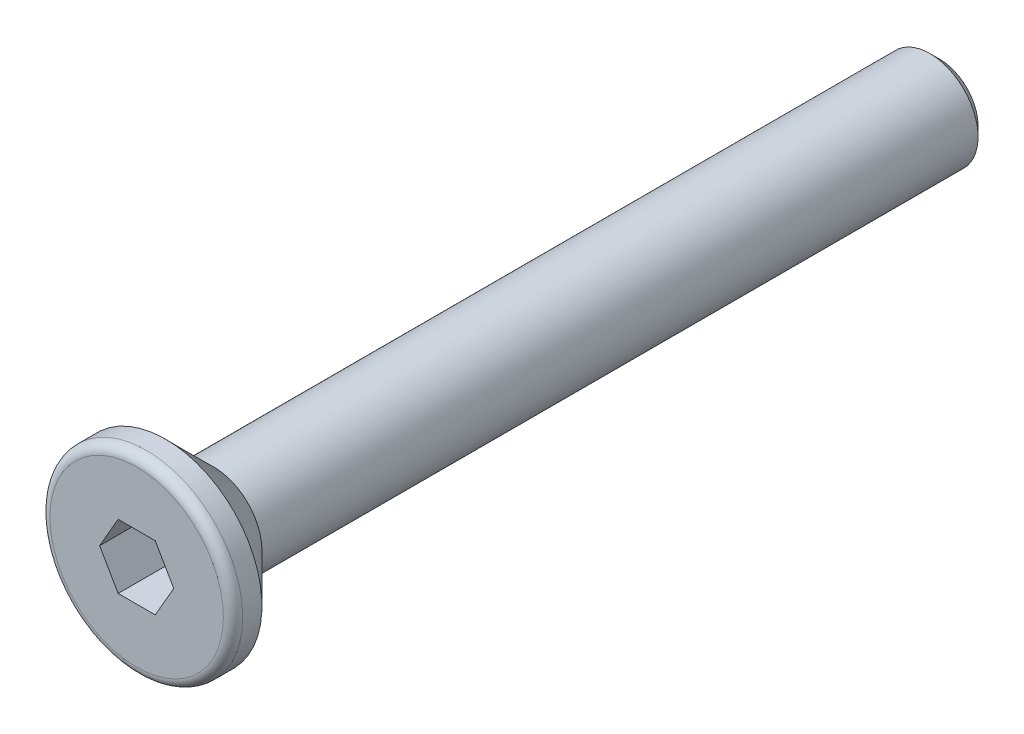
ISO-10303-21;
HEADER;
FILE_DESCRIPTION(('STEP AP214'),'2;1');
FILE_NAME('part.step','',(''),(''),'','','');
FILE_SCHEMA(('AUTOMOTIVE_DESIGN { 1 0 10303 214 1 1 1 1 }'));
ENDSEC;
DATA;
#1=APPLICATION_CONTEXT('core data for automotive mechanical design processes');
#2=APPLICATION_PROTOCOL_DEFINITION('international standard','automotive_design',2000,#1);
#3=PRODUCT_CONTEXT('',#1,'mechanical');
#4=PRODUCT('Part','Part','',(#3));
#5=PRODUCT_RELATED_PRODUCT_CATEGORY('part','',(#4));
#6=PRODUCT_DEFINITION_FORMATION('','',#4);
#7=PRODUCT_DEFINITION_CONTEXT('part definition',#1,'design');
#8=PRODUCT_DEFINITION('design','',#6,#7);
#9=PRODUCT_DEFINITION_SHAPE('','',#8);
#10=(LENGTH_UNIT() NAMED_UNIT(*) SI_UNIT(.MILLI.,.METRE.));
#11=(NAMED_UNIT(*) PLANE_ANGLE_UNIT() SI_UNIT($,.RADIAN.));
#12=(NAMED_UNIT(*) SI_UNIT($,.STERADIAN.) SOLID_ANGLE_UNIT());
#13=UNCERTAINTY_MEASURE_WITH_UNIT(LENGTH_MEASURE(1.E-05),#10,'distance_accuracy_value','');
#14=(GEOMETRIC_REPRESENTATION_CONTEXT(3) GLOBAL_UNCERTAINTY_ASSIGNED_CONTEXT((#13)) GLOBAL_UNIT_ASSIGNED_CONTEXT((#10,
#11,#12)) REPRESENTATION_CONTEXT('',''));
#15=CARTESIAN_POINT('',(0.,0.,0.));
#16=DIRECTION('',(0.,0.,1.));
#17=DIRECTION('',(1.,0.,0.));
#18=AXIS2_PLACEMENT_3D('',#15,#16,#17);
#19=CARTESIAN_POINT('',(0.,0.,12.5));
#20=DIRECTION('',(0.,0.,1.));
#21=DIRECTION('',(1.,0.,0.));
#22=AXIS2_PLACEMENT_3D('',#19,#20,#21);
#23=PLANE('',#22);
#24=CARTESIAN_POINT('',(0.,0.,12.5));
#25=DIRECTION('',(0.,0.,1.));
#26=DIRECTION('',(1.,0.,0.));
#27=AXIS2_PLACEMENT_3D('',#24,#25,#26);
#28=CIRCLE('',#27,2.7);
#29=CARTESIAN_POINT('',(2.7,0.,12.5));
#30=VERTEX_POINT('',#29);
#31=EDGE_CURVE('E11',#30,#30,#28,.T.);
#32=ORIENTED_EDGE('',*,*,#31,.T.);
#33=EDGE_LOOP('',(#32));
#34=FACE_BOUND('',#33,.T.);
#35=DIRECTION('',(0.5,0.866025403784439,0.));
#36=VECTOR('',#35,1.);
#37=CARTESIAN_POINT('',(0.577350269189626,-1.,12.5));
#38=LINE('',#37,#36);
#39=CARTESIAN_POINT('',(0.577350269189626,-1.,12.5));
#40=VERTEX_POINT('',#39);
#41=CARTESIAN_POINT('',(1.15470053837925,0.,12.5));
#42=VERTEX_POINT('',#41);
#43=EDGE_CURVE('E50',#40,#42,#38,.T.);
#44=ORIENTED_EDGE('',*,*,#43,.F.);
#45=DIRECTION('',(1.,0.,0.));
#46=VECTOR('',#45,1.);
#47=CARTESIAN_POINT('',(-0.577350269189626,-1.,12.5));
#48=LINE('',#47,#46);
#49=CARTESIAN_POINT('',(-0.577350269189626,-1.,12.5));
#50=VERTEX_POINT('',#49);
#51=EDGE_CURVE('E133',#50,#40,#48,.T.);
#52=ORIENTED_EDGE('',*,*,#51,.F.);
#53=DIRECTION('',(0.5,-0.866025403784438,0.));
#54=VECTOR('',#53,1.);
#55=CARTESIAN_POINT('',(-1.15470053837925,0.,12.5));
#56=LINE('',#55,#54);
#57=CARTESIAN_POINT('',(-1.15470053837925,0.,12.5));
#58=VERTEX_POINT('',#57);
#59=EDGE_CURVE('E131',#58,#50,#56,.T.);
#60=ORIENTED_EDGE('',*,*,#59,.F.);
#61=DIRECTION('',(-0.5,-0.866025403784439,0.));
#62=VECTOR('',#61,1.);
#63=CARTESIAN_POINT('',(-0.577350269189626,1.,12.5));
#64=LINE('',#63,#62);
#65=CARTESIAN_POINT('',(-0.577350269189626,1.,12.5));
#66=VERTEX_POINT('',#65);
#67=EDGE_CURVE('E98',#66,#58,#64,.T.);
#68=ORIENTED_EDGE('',*,*,#67,.F.);
#69=DIRECTION('',(-1.,0.,0.));
#70=VECTOR('',#69,1.);
#71=CARTESIAN_POINT('',(0.577350269189626,1.,12.5));
#72=LINE('',#71,#70);
#73=CARTESIAN_POINT('',(0.577350269189626,1.,12.5));
#74=VERTEX_POINT('',#73);
#75=EDGE_CURVE('E127',#74,#66,#72,.T.);
#76=ORIENTED_EDGE('',*,*,#75,.F.);
#77=DIRECTION('',(-0.5,0.866025403784438,0.));
#78=VECTOR('',#77,1.);
#79=CARTESIAN_POINT('',(1.15470053837925,0.,12.5));
#80=LINE('',#79,#78);
#81=EDGE_CURVE('E124',#42,#74,#80,.T.);
#82=ORIENTED_EDGE('',*,*,#81,.F.);
#83=EDGE_LOOP('',(#44,#52,#60,#68,#76,#82));
#84=FACE_BOUND('',#83,.T.);
#85=ADVANCED_FACE('F35',(#34,#84),#23,.T.);
#86=CARTESIAN_POINT('',(0.,0.,-12.5));
#87=DIRECTION('',(0.,0.,-1.));
#88=DIRECTION('',(-1.,0.,0.));
#89=AXIS2_PLACEMENT_3D('',#86,#87,#88);
#90=CYLINDRICAL_SURFACE('',#89,3.);
#91=CARTESIAN_POINT('',(0.,0.,12.2));
#92=DIRECTION('',(0.,0.,1.));
#93=DIRECTION('',(1.,0.,0.));
#94=AXIS2_PLACEMENT_3D('',#91,#92,#93);
#95=CIRCLE('',#94,3.);
#96=CARTESIAN_POINT('',(3.,0.,12.2));
#97=VERTEX_POINT('',#96);
#98=EDGE_CURVE('E43',#97,#97,#95,.F.);
#99=ORIENTED_EDGE('',*,*,#98,.T.);
#100=EDGE_LOOP('',(#99));
#101=FACE_BOUND('',#100,.T.);
#102=CARTESIAN_POINT('',(0.,0.,11.6));
#103=DIRECTION('',(0.,0.,-1.));
#104=DIRECTION('',(-1.,0.,0.));
#105=AXIS2_PLACEMENT_3D('',#102,#103,#104);
#106=CIRCLE('',#105,3.);
#107=CARTESIAN_POINT('',(-3.,0.,11.6));
#108=VERTEX_POINT('',#107);
#109=EDGE_CURVE('E151',#108,#108,#106,.T.);
#110=ORIENTED_EDGE('',*,*,#109,.F.);
#111=EDGE_LOOP('',(#110));
#112=FACE_BOUND('',#111,.T.);
#113=ADVANCED_FACE('F156',(#101,#112),#90,.T.);
#114=CARTESIAN_POINT('',(0.,0.,10.1));
#115=DIRECTION('',(0.,0.,1.));
#116=DIRECTION('',(1.,0.,0.));
#117=AXIS2_PLACEMENT_3D('',#114,#115,#116);
#118=CONICAL_SURFACE('',#117,1.5,0.785398163397442);
#119=ORIENTED_EDGE('',*,*,#109,.T.);
#120=EDGE_LOOP('',(#119));
#121=FACE_BOUND('',#120,.T.);
#122=CARTESIAN_POINT('',(0.,0.,10.1));
#123=DIRECTION('',(0.,0.,-1.));
#124=DIRECTION('',(-1.,0.,0.));
#125=AXIS2_PLACEMENT_3D('',#122,#123,#124);
#126=CIRCLE('',#125,1.5);
#127=CARTESIAN_POINT('',(-1.5,0.,10.1));
#128=VERTEX_POINT('',#127);
#129=EDGE_CURVE('E148',#128,#128,#126,.T.);
#130=ORIENTED_EDGE('',*,*,#129,.F.);
#131=EDGE_LOOP('',(#130));
#132=FACE_BOUND('',#131,.T.);
#133=ADVANCED_FACE('F172',(#121,#132),#118,.T.);
#134=CARTESIAN_POINT('',(0.,0.,-12.5));
#135=DIRECTION('',(0.,0.,-1.));
#136=DIRECTION('',(-1.,0.,0.));
#137=AXIS2_PLACEMENT_3D('',#134,#135,#136);
#138=CYLINDRICAL_SURFACE('',#137,1.5);
#139=ORIENTED_EDGE('',*,*,#129,.T.);
#140=EDGE_LOOP('',(#139));
#141=FACE_BOUND('',#140,.T.);
#142=CARTESIAN_POINT('',(0.,0.,-12.2));
#143=DIRECTION('',(0.,0.,-1.));
#144=DIRECTION('',(-1.,0.,0.));
#145=AXIS2_PLACEMENT_3D('',#142,#143,#144);
#146=CIRCLE('',#145,1.5);
#147=CARTESIAN_POINT('',(-1.5,0.,-12.2));
#148=VERTEX_POINT('',#147);
#149=EDGE_CURVE('E145',#148,#148,#146,.T.);
#150=ORIENTED_EDGE('',*,*,#149,.F.);
#151=EDGE_LOOP('',(#150));
#152=FACE_BOUND('',#151,.T.);
#153=ADVANCED_FACE('F178',(#141,#152),#138,.T.);
#154=CARTESIAN_POINT('',(0.,0.,-12.5));
#155=DIRECTION('',(0.,0.,1.));
#156=DIRECTION('',(1.,0.,0.));
#157=AXIS2_PLACEMENT_3D('',#154,#155,#156);
#158=CONICAL_SURFACE('',#157,1.2,0.785398163397442);
#159=ORIENTED_EDGE('',*,*,#149,.T.);
#160=EDGE_LOOP('',(#159));
#161=FACE_BOUND('',#160,.T.);
#162=CARTESIAN_POINT('',(0.,0.,-12.5));
#163=DIRECTION('',(0.,0.,-1.));
#164=DIRECTION('',(-1.,0.,0.));
#165=AXIS2_PLACEMENT_3D('',#162,#163,#164);
#166=CIRCLE('',#165,1.2);
#167=CARTESIAN_POINT('',(-1.2,0.,-12.5));
#168=VERTEX_POINT('',#167);
#169=EDGE_CURVE('E137',#168,#168,#166,.T.);
#170=ORIENTED_EDGE('',*,*,#169,.F.);
#171=EDGE_LOOP('',(#170));
#172=FACE_BOUND('',#171,.T.);
#173=ADVANCED_FACE('F182',(#161,#172),#158,.T.);
#174=CARTESIAN_POINT('',(0.,1.2,-12.5));
#175=DIRECTION('',(0.,0.,-1.));
#176=DIRECTION('',(-1.,0.,0.));
#177=AXIS2_PLACEMENT_3D('',#174,#175,#176);
#178=PLANE('',#177);
#179=ORIENTED_EDGE('',*,*,#169,.T.);
#180=EDGE_LOOP('',(#179));
#181=FACE_BOUND('',#180,.T.);
#182=ADVANCED_FACE('F186',(#181),#178,.T.);
#183=CARTESIAN_POINT('',(0.577350269189626,-1.,11.));
#184=DIRECTION('',(0.866025403784438,-0.5,0.));
#185=DIRECTION('',(0.5,0.866025403784439,0.));
#186=AXIS2_PLACEMENT_3D('',#183,#184,#185);
#187=PLANE('',#186);
#188=ORIENTED_EDGE('',*,*,#43,.T.);
#189=DIRECTION('',(0.,0.,1.));
#190=VECTOR('',#189,1.);
#191=CARTESIAN_POINT('',(1.15470053837925,0.,11.));
#192=LINE('',#191,#190);
#193=CARTESIAN_POINT('',(1.15470053837925,0.,11.));
#194=VERTEX_POINT('',#193);
#195=EDGE_CURVE('E80',#194,#42,#192,.T.);
#196=ORIENTED_EDGE('',*,*,#195,.F.);
#197=DIRECTION('',(0.5,0.866025403784439,0.));
#198=VECTOR('',#197,1.);
#199=CARTESIAN_POINT('',(0.577350269189626,-1.,11.));
#200=LINE('',#199,#198);
#201=CARTESIAN_POINT('',(0.577350269189626,-1.,11.));
#202=VERTEX_POINT('',#201);
#203=EDGE_CURVE('E135',#202,#194,#200,.T.);
#204=ORIENTED_EDGE('',*,*,#203,.F.);
#205=DIRECTION('',(0.,0.,1.));
#206=VECTOR('',#205,1.);
#207=CARTESIAN_POINT('',(0.577350269189626,-1.,11.));
#208=LINE('',#207,#206);
#209=EDGE_CURVE('E58',#202,#40,#208,.T.);
#210=ORIENTED_EDGE('',*,*,#209,.T.);
#211=EDGE_LOOP('',(#188,#196,#204,#210));
#212=FACE_BOUND('',#211,.T.);
#213=ADVANCED_FACE('F190',(#212),#187,.F.);
#214=CARTESIAN_POINT('',(-0.577350269189626,-1.,11.));
#215=DIRECTION('',(0.,-1.,0.));
#216=DIRECTION('',(1.,0.,0.));
#217=AXIS2_PLACEMENT_3D('',#214,#215,#216);
#218=PLANE('',#217);
#219=ORIENTED_EDGE('',*,*,#51,.T.);
#220=ORIENTED_EDGE('',*,*,#209,.F.);
#221=DIRECTION('',(1.,0.,0.));
#222=VECTOR('',#221,1.);
#223=CARTESIAN_POINT('',(-0.577350269189626,-1.,11.));
#224=LINE('',#223,#222);
#225=CARTESIAN_POINT('',(-0.577350269189626,-1.,11.));
#226=VERTEX_POINT('',#225);
#227=EDGE_CURVE('E110',#226,#202,#224,.T.);
#228=ORIENTED_EDGE('',*,*,#227,.F.);
#229=DIRECTION('',(0.,0.,1.));
#230=VECTOR('',#229,1.);
#231=CARTESIAN_POINT('',(-0.577350269189626,-1.,11.));
#232=LINE('',#231,#230);
#233=EDGE_CURVE('E102',#226,#50,#232,.T.);
#234=ORIENTED_EDGE('',*,*,#233,.T.);
#235=EDGE_LOOP('',(#219,#220,#228,#234));
#236=FACE_BOUND('',#235,.T.);
#237=ADVANCED_FACE('F194',(#236),#218,.F.);
#238=CARTESIAN_POINT('',(-1.15470053837925,0.,11.));
#239=DIRECTION('',(-0.866025403784439,-0.5,0.));
#240=DIRECTION('',(0.5,-0.866025403784439,0.));
#241=AXIS2_PLACEMENT_3D('',#238,#239,#240);
#242=PLANE('',#241);
#243=ORIENTED_EDGE('',*,*,#59,.T.);
#244=ORIENTED_EDGE('',*,*,#233,.F.);
#245=DIRECTION('',(0.5,-0.866025403784438,0.));
#246=VECTOR('',#245,1.);
#247=CARTESIAN_POINT('',(-1.15470053837925,0.,11.));
#248=LINE('',#247,#246);
#249=CARTESIAN_POINT('',(-1.15470053837925,0.,11.));
#250=VERTEX_POINT('',#249);
#251=EDGE_CURVE('E106',#250,#226,#248,.T.);
#252=ORIENTED_EDGE('',*,*,#251,.F.);
#253=DIRECTION('',(0.,0.,1.));
#254=VECTOR('',#253,1.);
#255=CARTESIAN_POINT('',(-1.15470053837925,0.,11.));
#256=LINE('',#255,#254);
#257=EDGE_CURVE('E91',#250,#58,#256,.T.);
#258=ORIENTED_EDGE('',*,*,#257,.T.);
#259=EDGE_LOOP('',(#243,#244,#252,#258));
#260=FACE_BOUND('',#259,.T.);
#261=ADVANCED_FACE('F107',(#260),#242,.F.);
#262=CARTESIAN_POINT('',(-0.577350269189626,1.,11.));
#263=DIRECTION('',(-0.866025403784439,0.5,0.));
#264=DIRECTION('',(-0.5,-0.866025403784439,0.));
#265=AXIS2_PLACEMENT_3D('',#262,#263,#264);
#266=PLANE('',#265);
#267=ORIENTED_EDGE('',*,*,#67,.T.);
#268=ORIENTED_EDGE('',*,*,#257,.F.);
#269=DIRECTION('',(-0.5,-0.866025403784439,0.));
#270=VECTOR('',#269,1.);
#271=CARTESIAN_POINT('',(-0.577350269189626,1.,11.));
#272=LINE('',#271,#270);
#273=CARTESIAN_POINT('',(-0.577350269189626,1.,11.));
#274=VERTEX_POINT('',#273);
#275=EDGE_CURVE('E95',#274,#250,#272,.T.);
#276=ORIENTED_EDGE('',*,*,#275,.F.);
#277=DIRECTION('',(0.,0.,1.));
#278=VECTOR('',#277,1.);
#279=CARTESIAN_POINT('',(-0.577350269189626,1.,11.));
#280=LINE('',#279,#278);
#281=EDGE_CURVE('E103',#274,#66,#280,.T.);
#282=ORIENTED_EDGE('',*,*,#281,.T.);
#283=EDGE_LOOP('',(#267,#268,#276,#282));
#284=FACE_BOUND('',#283,.T.);
#285=ADVANCED_FACE('F93',(#284),#266,.F.);
#286=CARTESIAN_POINT('',(0.577350269189626,1.,11.));
#287=DIRECTION('',(0.,1.,0.));
#288=DIRECTION('',(-1.,0.,0.));
#289=AXIS2_PLACEMENT_3D('',#286,#287,#288);
#290=PLANE('',#289);
#291=ORIENTED_EDGE('',*,*,#75,.T.);
#292=ORIENTED_EDGE('',*,*,#281,.F.);
#293=DIRECTION('',(-1.,0.,0.));
#294=VECTOR('',#293,1.);
#295=CARTESIAN_POINT('',(0.577350269189626,1.,11.));
#296=LINE('',#295,#294);
#297=CARTESIAN_POINT('',(0.577350269189626,1.,11.));
#298=VERTEX_POINT('',#297);
#299=EDGE_CURVE('E116',#298,#274,#296,.T.);
#300=ORIENTED_EDGE('',*,*,#299,.F.);
#301=DIRECTION('',(0.,0.,1.));
#302=VECTOR('',#301,1.);
#303=CARTESIAN_POINT('',(0.577350269189626,1.,11.));
#304=LINE('',#303,#302);
#305=EDGE_CURVE('E140',#298,#74,#304,.T.);
#306=ORIENTED_EDGE('',*,*,#305,.T.);
#307=EDGE_LOOP('',(#291,#292,#300,#306));
#308=FACE_BOUND('',#307,.T.);
#309=ADVANCED_FACE('F197',(#308),#290,.F.);
#310=CARTESIAN_POINT('',(1.15470053837925,0.,11.));
#311=DIRECTION('',(0.866025403784439,0.5,0.));
#312=DIRECTION('',(-0.5,0.866025403784439,0.));
#313=AXIS2_PLACEMENT_3D('',#310,#311,#312);
#314=PLANE('',#313);
#315=ORIENTED_EDGE('',*,*,#81,.T.);
#316=ORIENTED_EDGE('',*,*,#305,.F.);
#317=DIRECTION('',(-0.5,0.866025403784438,0.));
#318=VECTOR('',#317,1.);
#319=CARTESIAN_POINT('',(1.15470053837925,0.,11.));
#320=LINE('',#319,#318);
#321=EDGE_CURVE('E118',#194,#298,#320,.T.);
#322=ORIENTED_EDGE('',*,*,#321,.F.);
#323=ORIENTED_EDGE('',*,*,#195,.T.);
#324=EDGE_LOOP('',(#315,#316,#322,#323));
#325=FACE_BOUND('',#324,.T.);
#326=ADVANCED_FACE('F164',(#325),#314,.F.);
#327=CARTESIAN_POINT('',(0.,0.,11.));
#328=DIRECTION('',(0.,0.,1.));
#329=DIRECTION('',(1.,0.,0.));
#330=AXIS2_PLACEMENT_3D('',#327,#328,#329);
#331=PLANE('',#330);
#332=ORIENTED_EDGE('',*,*,#203,.T.);
#333=ORIENTED_EDGE('',*,*,#321,.T.);
#334=ORIENTED_EDGE('',*,*,#299,.T.);
#335=ORIENTED_EDGE('',*,*,#275,.T.);
#336=ORIENTED_EDGE('',*,*,#251,.T.);
#337=ORIENTED_EDGE('',*,*,#227,.T.);
#338=EDGE_LOOP('',(#332,#333,#334,#335,#336,#337));
#339=FACE_BOUND('',#338,.T.);
#340=ADVANCED_FACE('F113',(#339),#331,.T.);
#341=CARTESIAN_POINT('',(0.,0.,12.2));
#342=DIRECTION('',(0.,0.,1.));
#343=DIRECTION('',(1.,0.,0.));
#344=AXIS2_PLACEMENT_3D('',#341,#342,#343);
#345=TOROIDAL_SURFACE('',#344,2.7,0.3);
#346=ORIENTED_EDGE('',*,*,#31,.F.);
#347=EDGE_LOOP('',(#346));
#348=FACE_BOUND('',#347,.T.);
#349=ORIENTED_EDGE('',*,*,#98,.F.);
#350=EDGE_LOOP('',(#349));
#351=FACE_BOUND('',#350,.T.);
#352=ADVANCED_FACE('F37',(#348,#351),#345,.T.);
#353=CLOSED_SHELL('',(#85,#113,#133,#153,#173,#182,#213,#237,#261,#285,#309,#326,#340,#352));
#354=MANIFOLD_SOLID_BREP('B2',#353);
#355=ADVANCED_BREP_SHAPE_REPRESENTATION('',(#18,#354),#14);
#356=SHAPE_DEFINITION_REPRESENTATION(#9,#355);
ENDSEC;
END-ISO-10303-21;
